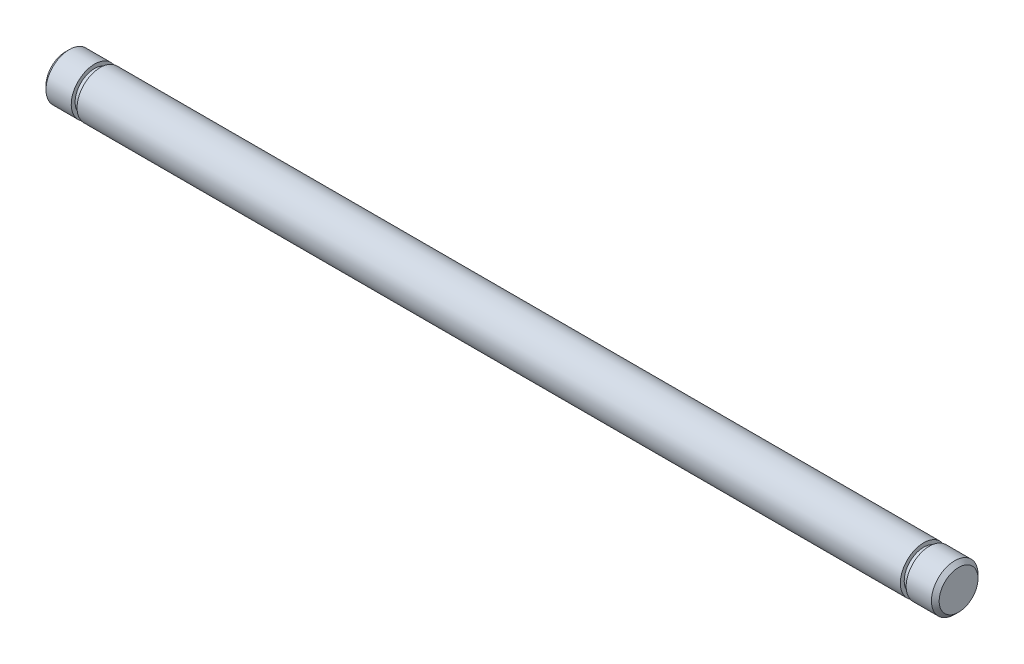
ISO-10303-21;
HEADER;
FILE_DESCRIPTION(('STEP AP214'),'2;1');
FILE_NAME('part.step','',(''),(''),'','','');
FILE_SCHEMA(('AUTOMOTIVE_DESIGN { 1 0 10303 214 1 1 1 1 }'));
ENDSEC;
DATA;
#1=APPLICATION_CONTEXT('core data for automotive mechanical design processes');
#2=APPLICATION_PROTOCOL_DEFINITION('international standard','automotive_design',2000,#1);
#3=PRODUCT_CONTEXT('',#1,'mechanical');
#4=PRODUCT('Part','Part','',(#3));
#5=PRODUCT_RELATED_PRODUCT_CATEGORY('part','',(#4));
#6=PRODUCT_DEFINITION_FORMATION('','',#4);
#7=PRODUCT_DEFINITION_CONTEXT('part definition',#1,'design');
#8=PRODUCT_DEFINITION('design','',#6,#7);
#9=PRODUCT_DEFINITION_SHAPE('','',#8);
#10=(LENGTH_UNIT() NAMED_UNIT(*) SI_UNIT(.MILLI.,.METRE.));
#11=(NAMED_UNIT(*) PLANE_ANGLE_UNIT() SI_UNIT($,.RADIAN.));
#12=(NAMED_UNIT(*) SI_UNIT($,.STERADIAN.) SOLID_ANGLE_UNIT());
#13=UNCERTAINTY_MEASURE_WITH_UNIT(LENGTH_MEASURE(1.E-05),#10,'distance_accuracy_value','');
#14=(GEOMETRIC_REPRESENTATION_CONTEXT(3) GLOBAL_UNCERTAINTY_ASSIGNED_CONTEXT((#13)) GLOBAL_UNIT_ASSIGNED_CONTEXT((#10,
#11,#12)) REPRESENTATION_CONTEXT('',''));
#15=CARTESIAN_POINT('',(0.,0.,0.));
#16=DIRECTION('',(0.,0.,1.));
#17=DIRECTION('',(1.,0.,0.));
#18=AXIS2_PLACEMENT_3D('',#15,#16,#17);
#19=CARTESIAN_POINT('',(0.,1.5,0.));
#20=DIRECTION('',(1.,0.,0.));
#21=DIRECTION('',(0.,0.,-1.));
#22=AXIS2_PLACEMENT_3D('',#19,#20,#21);
#23=PLANE('',#22);
#24=CARTESIAN_POINT('',(2.84216769043388E-10,0.,0.));
#25=DIRECTION('',(-1.,0.,0.));
#26=DIRECTION('',(0.,-1.,0.));
#27=AXIS2_PLACEMENT_3D('',#24,#25,#26);
#28=CIRCLE('',#27,2.50000000016826);
#29=CARTESIAN_POINT('',(2.84217085269022E-10,-2.50000000016826,0.));
#30=VERTEX_POINT('',#29);
#31=EDGE_CURVE('E18',#30,#30,#28,.T.);
#32=ORIENTED_EDGE('',*,*,#31,.F.);
#33=EDGE_LOOP('',(#32));
#34=FACE_BOUND('',#33,.T.);
#35=ADVANCED_FACE('F15',(#34),#23,.T.);
#36=CARTESIAN_POINT('',(-115.,1.49999999999998,0.));
#37=DIRECTION('',(-1.,0.,0.));
#38=DIRECTION('',(0.,0.,1.));
#39=AXIS2_PLACEMENT_3D('',#36,#37,#38);
#40=PLANE('',#39);
#41=CARTESIAN_POINT('',(-115.000000000236,0.,0.));
#42=DIRECTION('',(1.,0.,0.));
#43=DIRECTION('',(0.,0.,-1.));
#44=AXIS2_PLACEMENT_3D('',#41,#42,#43);
#45=CIRCLE('',#44,2.50000000016824);
#46=CARTESIAN_POINT('',(-115.000000000236,0.,-2.50000000016824));
#47=VERTEX_POINT('',#46);
#48=EDGE_CURVE('E50',#47,#47,#45,.T.);
#49=ORIENTED_EDGE('',*,*,#48,.F.);
#50=EDGE_LOOP('',(#49));
#51=FACE_BOUND('',#50,.T.);
#52=ADVANCED_FACE('F63',(#51),#40,.T.);
#53=CARTESIAN_POINT('',(-0.500000000101864,0.,0.));
#54=DIRECTION('',(-1.,0.,0.));
#55=DIRECTION('',(0.,-1.,0.));
#56=AXIS2_PLACEMENT_3D('',#53,#54,#55);
#57=CONICAL_SURFACE('',#56,2.99999999970169,0.785398162544797);
#58=ORIENTED_EDGE('',*,*,#31,.T.);
#59=EDGE_LOOP('',(#58));
#60=FACE_BOUND('',#59,.T.);
#61=CARTESIAN_POINT('',(-0.5,0.,0.));
#62=DIRECTION('',(1.,0.,0.));
#63=DIRECTION('',(0.,1.,0.));
#64=AXIS2_PLACEMENT_3D('',#61,#62,#63);
#65=CIRCLE('',#64,3.);
#66=CARTESIAN_POINT('',(-0.500000000000001,3.,0.));
#67=VERTEX_POINT('',#66);
#68=EDGE_CURVE('E52',#67,#67,#65,.F.);
#69=ORIENTED_EDGE('',*,*,#68,.F.);
#70=EDGE_LOOP('',(#69));
#71=FACE_BOUND('',#70,.T.);
#72=ADVANCED_FACE('F59',(#60,#71),#57,.T.);
#73=CARTESIAN_POINT('',(-114.49999999985,0.,0.));
#74=DIRECTION('',(1.,0.,0.));
#75=DIRECTION('',(0.,0.,-1.));
#76=AXIS2_PLACEMENT_3D('',#73,#74,#75);
#77=CONICAL_SURFACE('',#76,2.99999999970167,0.785398162544797);
#78=CARTESIAN_POINT('',(-114.5,0.,0.));
#79=DIRECTION('',(1.,0.,0.));
#80=DIRECTION('',(0.,1.,0.));
#81=AXIS2_PLACEMENT_3D('',#78,#79,#80);
#82=CIRCLE('',#81,2.99999999999999);
#83=CARTESIAN_POINT('',(-114.5,2.99999999999997,0.));
#84=VERTEX_POINT('',#83);
#85=EDGE_CURVE('E49',#84,#84,#82,.T.);
#86=ORIENTED_EDGE('',*,*,#85,.F.);
#87=EDGE_LOOP('',(#86));
#88=FACE_BOUND('',#87,.T.);
#89=ORIENTED_EDGE('',*,*,#48,.T.);
#90=EDGE_LOOP('',(#89));
#91=FACE_BOUND('',#90,.T.);
#92=ADVANCED_FACE('F107',(#88,#91),#77,.T.);
#93=CARTESIAN_POINT('',(-1.875,0.,0.));
#94=DIRECTION('',(1.,0.,0.));
#95=DIRECTION('',(0.,1.,0.));
#96=AXIS2_PLACEMENT_3D('',#93,#94,#95);
#97=CYLINDRICAL_SURFACE('',#96,3.);
#98=ORIENTED_EDGE('',*,*,#68,.T.);
#99=EDGE_LOOP('',(#98));
#100=FACE_BOUND('',#99,.T.);
#101=CARTESIAN_POINT('',(-3.75,0.,0.));
#102=DIRECTION('',(1.,0.,0.));
#103=DIRECTION('',(0.,1.,0.));
#104=AXIS2_PLACEMENT_3D('',#101,#102,#103);
#105=CIRCLE('',#104,3.);
#106=CARTESIAN_POINT('',(-3.75,3.,0.));
#107=VERTEX_POINT('',#106);
#108=EDGE_CURVE('E47',#107,#107,#105,.F.);
#109=ORIENTED_EDGE('',*,*,#108,.F.);
#110=EDGE_LOOP('',(#109));
#111=FACE_BOUND('',#110,.T.);
#112=ADVANCED_FACE('F103',(#100,#111),#97,.T.);
#113=CARTESIAN_POINT('',(-113.125,0.,0.));
#114=DIRECTION('',(1.,0.,0.));
#115=DIRECTION('',(0.,1.,0.));
#116=AXIS2_PLACEMENT_3D('',#113,#114,#115);
#117=CYLINDRICAL_SURFACE('',#116,2.99999999999999);
#118=ORIENTED_EDGE('',*,*,#85,.T.);
#119=EDGE_LOOP('',(#118));
#120=FACE_BOUND('',#119,.T.);
#121=CARTESIAN_POINT('',(-111.25,0.,0.));
#122=DIRECTION('',(1.,0.,0.));
#123=DIRECTION('',(0.,1.,0.));
#124=AXIS2_PLACEMENT_3D('',#121,#122,#123);
#125=CIRCLE('',#124,2.99999999999999);
#126=CARTESIAN_POINT('',(-111.25,2.99999999999997,0.));
#127=VERTEX_POINT('',#126);
#128=EDGE_CURVE('E44',#127,#127,#125,.T.);
#129=ORIENTED_EDGE('',*,*,#128,.F.);
#130=EDGE_LOOP('',(#129));
#131=FACE_BOUND('',#130,.T.);
#132=ADVANCED_FACE('F99',(#120,#131),#117,.T.);
#133=CARTESIAN_POINT('',(-3.75,2.75000000000004,0.));
#134=DIRECTION('',(-1.,0.,0.));
#135=DIRECTION('',(0.,0.,1.));
#136=AXIS2_PLACEMENT_3D('',#133,#134,#135);
#137=PLANE('',#136);
#138=CARTESIAN_POINT('',(-3.75,0.,0.));
#139=DIRECTION('',(1.,0.,0.));
#140=DIRECTION('',(0.,1.,0.));
#141=AXIS2_PLACEMENT_3D('',#138,#139,#140);
#142=CIRCLE('',#141,2.50000000000008);
#143=CARTESIAN_POINT('',(-3.75,2.50000000000008,0.));
#144=VERTEX_POINT('',#143);
#145=EDGE_CURVE('E41',#144,#144,#142,.F.);
#146=ORIENTED_EDGE('',*,*,#145,.F.);
#147=EDGE_LOOP('',(#146));
#148=FACE_BOUND('',#147,.T.);
#149=ORIENTED_EDGE('',*,*,#108,.T.);
#150=EDGE_LOOP('',(#149));
#151=FACE_BOUND('',#150,.T.);
#152=ADVANCED_FACE('F95',(#148,#151),#137,.T.);
#153=CARTESIAN_POINT('',(-111.25,2.74999999999998,0.));
#154=DIRECTION('',(1.,0.,0.));
#155=DIRECTION('',(0.,0.,-1.));
#156=AXIS2_PLACEMENT_3D('',#153,#154,#155);
#157=PLANE('',#156);
#158=CARTESIAN_POINT('',(-111.25,0.,0.));
#159=DIRECTION('',(1.,0.,0.));
#160=DIRECTION('',(0.,1.,0.));
#161=AXIS2_PLACEMENT_3D('',#158,#159,#160);
#162=CIRCLE('',#161,2.5);
#163=CARTESIAN_POINT('',(-111.25,2.49999999999998,0.));
#164=VERTEX_POINT('',#163);
#165=EDGE_CURVE('E38',#164,#164,#162,.T.);
#166=ORIENTED_EDGE('',*,*,#165,.F.);
#167=EDGE_LOOP('',(#166));
#168=FACE_BOUND('',#167,.T.);
#169=ORIENTED_EDGE('',*,*,#128,.T.);
#170=EDGE_LOOP('',(#169));
#171=FACE_BOUND('',#170,.T.);
#172=ADVANCED_FACE('F91',(#168,#171),#157,.T.);
#173=CARTESIAN_POINT('',(-4.125,0.,0.));
#174=DIRECTION('',(1.,0.,0.));
#175=DIRECTION('',(0.,1.,0.));
#176=AXIS2_PLACEMENT_3D('',#173,#174,#175);
#177=CYLINDRICAL_SURFACE('',#176,2.50000000000008);
#178=CARTESIAN_POINT('',(-4.5,0.,0.));
#179=DIRECTION('',(1.,0.,0.));
#180=DIRECTION('',(0.,1.,0.));
#181=AXIS2_PLACEMENT_3D('',#178,#179,#180);
#182=CIRCLE('',#181,2.50000000000008);
#183=CARTESIAN_POINT('',(-4.5,2.50000000000008,0.));
#184=VERTEX_POINT('',#183);
#185=EDGE_CURVE('E35',#184,#184,#182,.F.);
#186=ORIENTED_EDGE('',*,*,#185,.F.);
#187=EDGE_LOOP('',(#186));
#188=FACE_BOUND('',#187,.T.);
#189=ORIENTED_EDGE('',*,*,#145,.T.);
#190=EDGE_LOOP('',(#189));
#191=FACE_BOUND('',#190,.T.);
#192=ADVANCED_FACE('F87',(#188,#191),#177,.T.);
#193=CARTESIAN_POINT('',(-110.875,0.,0.));
#194=DIRECTION('',(1.,0.,0.));
#195=DIRECTION('',(0.,1.,0.));
#196=AXIS2_PLACEMENT_3D('',#193,#194,#195);
#197=CYLINDRICAL_SURFACE('',#196,2.5);
#198=ORIENTED_EDGE('',*,*,#165,.T.);
#199=EDGE_LOOP('',(#198));
#200=FACE_BOUND('',#199,.T.);
#201=CARTESIAN_POINT('',(-110.5,0.,0.));
#202=DIRECTION('',(1.,0.,0.));
#203=DIRECTION('',(0.,1.,0.));
#204=AXIS2_PLACEMENT_3D('',#201,#202,#203);
#205=CIRCLE('',#204,2.5);
#206=CARTESIAN_POINT('',(-110.5,2.49999999999998,0.));
#207=VERTEX_POINT('',#206);
#208=EDGE_CURVE('E27',#207,#207,#205,.T.);
#209=ORIENTED_EDGE('',*,*,#208,.F.);
#210=EDGE_LOOP('',(#209));
#211=FACE_BOUND('',#210,.T.);
#212=ADVANCED_FACE('F83',(#200,#211),#197,.T.);
#213=CARTESIAN_POINT('',(-4.5,2.75000000000004,0.));
#214=DIRECTION('',(1.,0.,0.));
#215=DIRECTION('',(0.,0.,-1.));
#216=AXIS2_PLACEMENT_3D('',#213,#214,#215);
#217=PLANE('',#216);
#218=ORIENTED_EDGE('',*,*,#185,.T.);
#219=EDGE_LOOP('',(#218));
#220=FACE_BOUND('',#219,.T.);
#221=CARTESIAN_POINT('',(-4.5,0.,0.));
#222=DIRECTION('',(1.,0.,0.));
#223=DIRECTION('',(0.,1.,0.));
#224=AXIS2_PLACEMENT_3D('',#221,#222,#223);
#225=CIRCLE('',#224,2.99999999999999);
#226=CARTESIAN_POINT('',(-4.5,2.99999999999999,0.));
#227=VERTEX_POINT('',#226);
#228=EDGE_CURVE('E22',#227,#227,#225,.F.);
#229=ORIENTED_EDGE('',*,*,#228,.F.);
#230=EDGE_LOOP('',(#229));
#231=FACE_BOUND('',#230,.T.);
#232=ADVANCED_FACE('F76',(#220,#231),#217,.T.);
#233=CARTESIAN_POINT('',(-110.5,2.74999999999998,0.));
#234=DIRECTION('',(-1.,0.,0.));
#235=DIRECTION('',(0.,0.,1.));
#236=AXIS2_PLACEMENT_3D('',#233,#234,#235);
#237=PLANE('',#236);
#238=ORIENTED_EDGE('',*,*,#208,.T.);
#239=EDGE_LOOP('',(#238));
#240=FACE_BOUND('',#239,.T.);
#241=CARTESIAN_POINT('',(-110.5,0.,0.));
#242=DIRECTION('',(1.,0.,0.));
#243=DIRECTION('',(0.,1.,0.));
#244=AXIS2_PLACEMENT_3D('',#241,#242,#243);
#245=CIRCLE('',#244,2.99999999999999);
#246=CARTESIAN_POINT('',(-110.5,2.99999999999998,0.));
#247=VERTEX_POINT('',#246);
#248=EDGE_CURVE('E10',#247,#247,#245,.T.);
#249=ORIENTED_EDGE('',*,*,#248,.F.);
#250=EDGE_LOOP('',(#249));
#251=FACE_BOUND('',#250,.T.);
#252=ADVANCED_FACE('F71',(#240,#251),#237,.T.);
#253=CARTESIAN_POINT('',(-57.5,0.,0.));
#254=DIRECTION('',(1.,0.,0.));
#255=DIRECTION('',(0.,1.,0.));
#256=AXIS2_PLACEMENT_3D('',#253,#254,#255);
#257=CYLINDRICAL_SURFACE('',#256,2.99999999999999);
#258=ORIENTED_EDGE('',*,*,#248,.T.);
#259=EDGE_LOOP('',(#258));
#260=FACE_BOUND('',#259,.T.);
#261=ORIENTED_EDGE('',*,*,#228,.T.);
#262=EDGE_LOOP('',(#261));
#263=FACE_BOUND('',#262,.T.);
#264=ADVANCED_FACE('F69',(#260,#263),#257,.T.);
#265=CLOSED_SHELL('',(#35,#52,#72,#92,#112,#132,#152,#172,#192,#212,#232,#252,#264));
#266=MANIFOLD_SOLID_BREP('B1',#265);
#267=ADVANCED_BREP_SHAPE_REPRESENTATION('',(#18,#266),#14);
#268=SHAPE_DEFINITION_REPRESENTATION(#9,#267);
ENDSEC;
END-ISO-10303-21;
